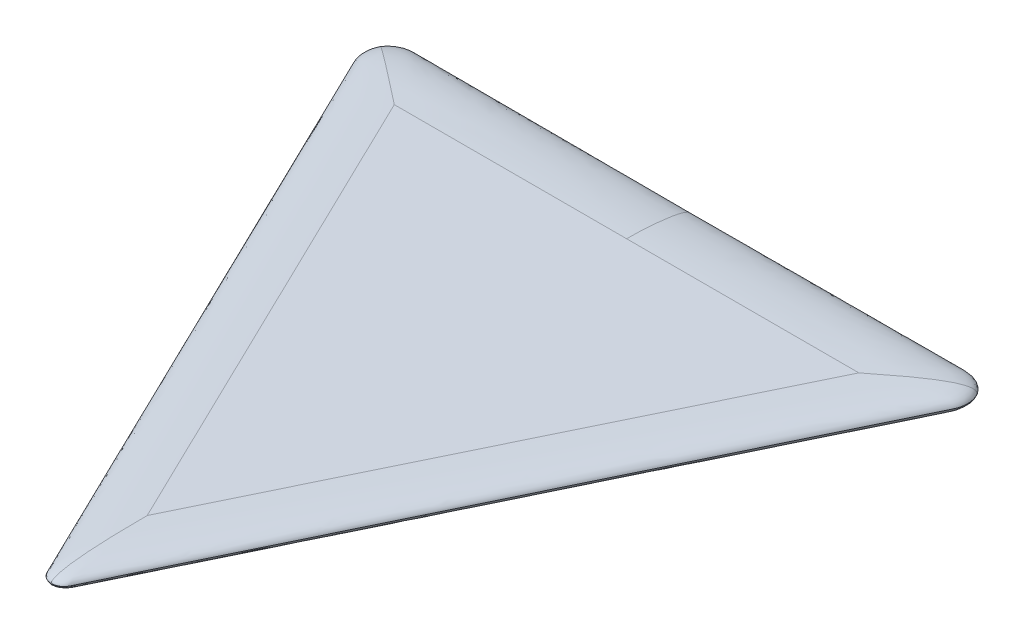
ISO-10303-21;
HEADER;
FILE_DESCRIPTION(('STEP AP214'),'2;1');
FILE_NAME('part.step','',(''),(''),'','','');
FILE_SCHEMA(('AUTOMOTIVE_DESIGN { 1 0 10303 214 1 1 1 1 }'));
ENDSEC;
DATA;
#1=APPLICATION_CONTEXT('core data for automotive mechanical design processes');
#2=APPLICATION_PROTOCOL_DEFINITION('international standard','automotive_design',2000,#1);
#3=PRODUCT_CONTEXT('',#1,'mechanical');
#4=PRODUCT('Part','Part','',(#3));
#5=PRODUCT_RELATED_PRODUCT_CATEGORY('part','',(#4));
#6=PRODUCT_DEFINITION_FORMATION('','',#4);
#7=PRODUCT_DEFINITION_CONTEXT('part definition',#1,'design');
#8=PRODUCT_DEFINITION('design','',#6,#7);
#9=PRODUCT_DEFINITION_SHAPE('','',#8);
#10=(LENGTH_UNIT() NAMED_UNIT(*) SI_UNIT(.MILLI.,.METRE.));
#11=(NAMED_UNIT(*) PLANE_ANGLE_UNIT() SI_UNIT($,.RADIAN.));
#12=(NAMED_UNIT(*) SI_UNIT($,.STERADIAN.) SOLID_ANGLE_UNIT());
#13=UNCERTAINTY_MEASURE_WITH_UNIT(LENGTH_MEASURE(1.E-05),#10,'distance_accuracy_value','');
#14=(GEOMETRIC_REPRESENTATION_CONTEXT(3) GLOBAL_UNCERTAINTY_ASSIGNED_CONTEXT((#13)) GLOBAL_UNIT_ASSIGNED_CONTEXT((#10,
#11,#12)) REPRESENTATION_CONTEXT('',''));
#15=CARTESIAN_POINT('',(0.,0.,0.));
#16=DIRECTION('',(0.,0.,1.));
#17=DIRECTION('',(1.,0.,0.));
#18=AXIS2_PLACEMENT_3D('',#15,#16,#17);
#19=CARTESIAN_POINT('',(0.,1.70008,0.));
#20=DIRECTION('',(0.,-1.,0.));
#21=DIRECTION('',(0.,0.,-1.));
#22=AXIS2_PLACEMENT_3D('',#19,#20,#21);
#23=PLANE('',#22);
#24=DIRECTION('',(1.,0.,0.));
#25=VECTOR('',#24,1.);
#26=CARTESIAN_POINT('',(18.1702141807132,1.70008,-90.));
#27=LINE('',#26,#25);
#28=CARTESIAN_POINT('',(0.,1.70008,-90.));
#29=VERTEX_POINT('',#28);
#30=CARTESIAN_POINT('',(36.3404283614264,1.70008,-90.));
#31=VERTEX_POINT('',#30);
#32=EDGE_CURVE('E117',#29,#31,#27,.T.);
#33=ORIENTED_EDGE('',*,*,#32,.F.);
#34=DIRECTION('',(-1.,0.,0.));
#35=VECTOR('',#34,1.);
#36=CARTESIAN_POINT('',(-18.1702141807132,1.70008,-90.));
#37=LINE('',#36,#35);
#38=CARTESIAN_POINT('',(-36.3404283614264,1.70008,-90.));
#39=VERTEX_POINT('',#38);
#40=EDGE_CURVE('E290',#29,#39,#37,.T.);
#41=ORIENTED_EDGE('',*,*,#40,.T.);
#42=DIRECTION('',(0.436048023411073,0.,0.899923397450748));
#43=VECTOR('',#42,1.);
#44=CARTESIAN_POINT('',(-18.1702141807132,1.70008,-52.5000000000001));
#45=LINE('',#44,#43);
#46=CARTESIAN_POINT('',(0.,1.70008,-15.));
#47=VERTEX_POINT('',#46);
#48=EDGE_CURVE('E291',#39,#47,#45,.T.);
#49=ORIENTED_EDGE('',*,*,#48,.T.);
#50=DIRECTION('',(-0.436048023411073,0.,0.899923397450748));
#51=VECTOR('',#50,1.);
#52=CARTESIAN_POINT('',(18.1702141807132,1.70008,-52.5000000000001));
#53=LINE('',#52,#51);
#54=EDGE_CURVE('E187',#31,#47,#53,.T.);
#55=ORIENTED_EDGE('',*,*,#54,.F.);
#56=EDGE_LOOP('',(#33,#41,#49,#55));
#57=FACE_BOUND('',#56,.T.);
#58=ADVANCED_FACE('F107',(#57),#23,.F.);
#59=CARTESIAN_POINT('',(0.,1.70008,-15.));
#60=CARTESIAN_POINT('',(0.253384960047637,1.70008,-15.5229402310443));
#61=CARTESIAN_POINT('',(0.506769920095274,1.70008,-16.0458804620886));
#62=CARTESIAN_POINT('',(12.1648822655975,1.70008,-40.1060928849216));
#63=CARTESIAN_POINT('',(23.5696096510522,1.70008,-63.643365076711));
#64=CARTESIAN_POINT('',(35.42970081148,1.70008,-88.1204248456664));
#65=CARTESIAN_POINT('',(35.8850645864532,1.70008,-89.0602124228332));
#66=CARTESIAN_POINT('',(36.3404283614264,1.70008,-90.));
#67=CARTESIAN_POINT('',(0.,1.70008,-14.7483994170613));
#68=CARTESIAN_POINT('',(0.262175055474778,1.70008,-15.2628231278992));
#69=CARTESIAN_POINT('',(0.523231572764904,1.70008,-15.7845503895561));
#70=CARTESIAN_POINT('',(12.2543452105578,1.70008,-39.9817941684924));
#71=CARTESIAN_POINT('',(23.7304872309625,1.70008,-63.6531193881907));
#72=CARTESIAN_POINT('',(35.6648444437097,1.70008,-88.2695846052202));
#73=CARTESIAN_POINT('',(36.1115618703193,1.70008,-89.2186910639662));
#74=CARTESIAN_POINT('',(36.5477424877341,1.70008,-90.1623624620553));
#75=CARTESIAN_POINT('',(0.,1.70008,-9.71638775828657));
#76=CARTESIAN_POINT('',(0.437976964017602,1.70007999999987,-10.0604810649973));
#77=CARTESIAN_POINT('',(0.852464626157506,1.70007999999974,-10.5579489389055));
#78=CARTESIAN_POINT('',(14.0436041097635,1.70007999999387,-37.4958198399082));
#79=CARTESIAN_POINT('',(26.9480388291692,1.70007999998813,-63.8482056177856));
#80=CARTESIAN_POINT('',(40.367717088304,1.70007999998216,-91.2527797962963));
#81=CARTESIAN_POINT('',(40.6415075476401,1.70007999998193,-92.3882638866267));
#82=CARTESIAN_POINT('',(40.6940250138874,1.7000799999817,-93.4096117031615));
#83=CARTESIAN_POINT('',(0.,1.44840525822499,0.));
#84=CARTESIAN_POINT('',(0.626841244543303,1.45005171313683,-0.216654959620347));
#85=CARTESIAN_POINT('',(1.20782242351586,1.45169816804867,-0.732755502816547));
#86=CARTESIAN_POINT('',(16.4599808033768,1.52745071599147,-32.384695120721));
#87=CARTESIAN_POINT('',(31.3806389002425,1.60155680902244,-63.3486909945762));
#88=CARTESIAN_POINT('',(46.8970435648643,1.67862178297451,-95.5490059467248));
#89=CARTESIAN_POINT('',(47.0213817375675,1.6815806638956,-96.9479499429976));
#90=CARTESIAN_POINT('',(46.7137107332878,1.68453954481669,-98.1240564523363));
#91=CARTESIAN_POINT('',(0.,0.,0.));
#92=CARTESIAN_POINT('',(0.766388457057767,0.,0.));
#93=CARTESIAN_POINT('',(1.4656646230364,0.,-0.438213049135394));
#94=CARTESIAN_POINT('',(16.8412153373915,0.,-32.1705386042371));
#95=CARTESIAN_POINT('',(31.8825838798813,0.,-63.2131732552963));
#96=CARTESIAN_POINT('',(47.5245186725572,0.,-95.4952668449226));
#97=CARTESIAN_POINT('',(47.4352189787637,0.,-96.9727134683373));
#98=CARTESIAN_POINT('',(46.7137107332878,0.,-98.1240564523363));
#99=B_SPLINE_SURFACE_WITH_KNOTS('',3,3,((#59,#60,#61,#62,#63,#64,#65,#66),(#67,#68,#69,#70,#71,
#72,#73,#74),(#75,#76,#77,#78,#79,#80,#81,#82),(#83,#84,#85,#86,#87,#88,#89,#90),(#91,#92,#93,
#94,#95,#96,#97,#98)),.UNSPECIFIED.,.F.,.F.,.F.,(4,1,4),(4,2,2,4),(0.,0.0500000000000003,1.),
(0.,0.0209176092417716,0.962408496913326,1.),.UNSPECIFIED.);
#100=CARTESIAN_POINT('',(0.,1.70008,-15.));
#101=CARTESIAN_POINT('',(0.,1.70008,-14.7483994170613));
#102=CARTESIAN_POINT('',(0.,1.70008,-9.71638775828657));
#103=CARTESIAN_POINT('',(0.,1.44840525822499,0.));
#104=CARTESIAN_POINT('',(0.,0.,0.));
#105=B_SPLINE_CURVE_WITH_KNOTS('',3,(#100,#101,#102,#103,#104),.UNSPECIFIED.,.F.,.F.,(4,1,4),
(0.,0.0500000000000003,1.),.UNSPECIFIED.);
#106=CARTESIAN_POINT('',(0.,0.,0.));
#107=VERTEX_POINT('',#106);
#108=EDGE_CURVE('E178',#47,#107,#105,.T.);
#109=CARTESIAN_POINT('',(46.7137107332878,0.,-98.1240564523363));
#110=CARTESIAN_POINT('',(47.4352189787637,0.,-96.9727134683373));
#111=CARTESIAN_POINT('',(47.5245186725572,0.,-95.4952668449226));
#112=CARTESIAN_POINT('',(31.8825838798813,0.,-63.2131732552963));
#113=CARTESIAN_POINT('',(16.8412153373915,0.,-32.1705386042371));
#114=CARTESIAN_POINT('',(1.4656646230364,0.,-0.438213049135394));
#115=CARTESIAN_POINT('',(0.766388457057767,0.,0.));
#116=CARTESIAN_POINT('',(0.,0.,0.));
#117=B_SPLINE_CURVE_WITH_KNOTS('',3,(#109,#110,#111,#112,#113,#114,#115,#116),.UNSPECIFIED.,.F.,
.F.,(4,2,2,4),(0.,0.0375915030866739,0.979082390758228,1.),.UNSPECIFIED.);
#118=CARTESIAN_POINT('',(46.7137107332888,0.,-98.1240564523345));
#119=VERTEX_POINT('',#118);
#120=EDGE_CURVE('E126',#119,#107,#117,.T.);
#121=CARTESIAN_POINT('',(36.3404283614264,1.70008,-90.));
#122=CARTESIAN_POINT('',(36.5477424877341,1.70008,-90.1623624620553));
#123=CARTESIAN_POINT('',(40.6940250138874,1.7000799999817,-93.4096117031615));
#124=CARTESIAN_POINT('',(46.7137107332878,1.68453954481669,-98.1240564523363));
#125=CARTESIAN_POINT('',(46.7137107332878,0.,-98.1240564523363));
#126=B_SPLINE_CURVE_WITH_KNOTS('',3,(#121,#122,#123,#124,#125),.UNSPECIFIED.,.F.,.F.,(4,1,4),
(0.,0.0500000000000003,1.),.UNSPECIFIED.);
#127=EDGE_CURVE('E13',#31,#119,#126,.T.);
#128=ORIENTED_EDGE('',*,*,#108,.T.);
#129=ORIENTED_EDGE('',*,*,#120,.F.);
#130=ORIENTED_EDGE('',*,*,#127,.F.);
#131=ORIENTED_EDGE('',*,*,#54,.T.);
#132=EDGE_LOOP('',(#128,#129,#130,#131));
#133=FACE_BOUND('',#132,.T.);
#134=ADVANCED_FACE('F185',(#133),#99,.T.);
#135=CARTESIAN_POINT('',(36.3404283614264,1.70008,-90.));
#136=CARTESIAN_POINT('',(35.2857398160419,1.70008,-90.));
#137=CARTESIAN_POINT('',(34.2310512706573,1.70008,-90.));
#138=CARTESIAN_POINT('',(22.1175751501819,1.70008,-90.));
#139=CARTESIAN_POINT('',(11.0587875750909,1.70008,-90.));
#140=CARTESIAN_POINT('',(0.,1.70008,-90.));
#141=CARTESIAN_POINT('',(36.5477424877341,1.70008,-90.1623624620553));
#142=CARTESIAN_POINT('',(35.4857020455283,1.70008,-90.1641963538898));
#143=CARTESIAN_POINT('',(34.423651735282,1.70008,-90.1659141197575));
#144=CARTESIAN_POINT('',(22.2276580394349,1.70008,-90.1761291989063));
#145=CARTESIAN_POINT('',(11.1055234829861,1.70008,-90.1723127937523));
#146=CARTESIAN_POINT('',(0.,1.70008,-90.1690580702388));
#147=CARTESIAN_POINT('',(40.6940250138874,1.7000799999817,-93.4096117031615));
#148=CARTESIAN_POINT('',(39.5193288204146,1.70007999998223,-93.499689218614));
#149=CARTESIAN_POINT('',(38.3159880549518,1.70007999998276,-93.5662232196789));
#150=CARTESIAN_POINT('',(24.4840947586229,1.70007999998886,-93.733507736501));
#151=CARTESIAN_POINT('',(12.0842421814155,1.70007999999443,-93.6365276301732));
#152=CARTESIAN_POINT('',(0.,1.70008,-93.5502194750155));
#153=CARTESIAN_POINT('',(46.7137107332878,1.68453954481669,-98.1240564523363));
#154=CARTESIAN_POINT('',(45.9922024878114,1.66959552312996,-99.2753994363351));
#155=CARTESIAN_POINT('',(44.7015526578853,1.65465150144322,-99.9999999999999));
#156=CARTESIAN_POINT('',(28.8828392217124,1.48301405393482,-100.000000000001));
#157=CARTESIAN_POINT('',(14.4414196108562,1.32632062811316,-100.));
#158=CARTESIAN_POINT('',(0.,1.16962720229148,-100.));
#159=CARTESIAN_POINT('',(46.7137107332878,0.,-98.1240564523363));
#160=CARTESIAN_POINT('',(45.9922024878114,0.,-99.275399436335));
#161=CARTESIAN_POINT('',(44.7015526578853,0.,-99.9999999999999));
#162=CARTESIAN_POINT('',(28.8828392217124,0.,-100.000000000001));
#163=CARTESIAN_POINT('',(14.4414196108562,0.,-100.));
#164=CARTESIAN_POINT('',(0.,0.,-100.));
#165=B_SPLINE_SURFACE_WITH_KNOTS('',3,3,((#135,#136,#137,#138,#139,#140),(#141,#142,#143,#144,
#145,#146),(#147,#148,#149,#150,#151,#152),(#153,#154,#155,#156,#157,#158),(#159,#160,#161,#162,
#163,#164)),.UNSPECIFIED.,.F.,.F.,.F.,(4,1,4),(4,2,4),(0.,0.0500000000000003,1.),(0.,
0.0870673731383997,1.),.UNSPECIFIED.);
#166=CARTESIAN_POINT('',(0.,0.,-100.));
#167=CARTESIAN_POINT('',(14.4414196108562,0.,-100.));
#168=CARTESIAN_POINT('',(28.8828392217124,0.,-100.000000000001));
#169=CARTESIAN_POINT('',(44.7015526578853,0.,-99.9999999999999));
#170=CARTESIAN_POINT('',(45.9922024878114,0.,-99.275399436335));
#171=CARTESIAN_POINT('',(46.7137107332878,0.,-98.1240564523363));
#172=B_SPLINE_CURVE_WITH_KNOTS('',3,(#166,#167,#168,#169,#170,#171),.UNSPECIFIED.,.F.,.F.,(4,2,
4),(0.,0.9129326268616,1.),.UNSPECIFIED.);
#173=CARTESIAN_POINT('',(0.,0.,-100.));
#174=VERTEX_POINT('',#173);
#175=EDGE_CURVE('E197',#174,#119,#172,.T.);
#176=CARTESIAN_POINT('',(0.,0.,-100.));
#177=CARTESIAN_POINT('',(0.,1.16962720229148,-100.));
#178=CARTESIAN_POINT('',(0.,1.70008,-93.5502194750155));
#179=CARTESIAN_POINT('',(0.,1.70008,-90.1690580702388));
#180=CARTESIAN_POINT('',(0.,1.70008,-90.));
#181=B_SPLINE_CURVE_WITH_KNOTS('',3,(#176,#177,#178,#179,#180),.UNSPECIFIED.,.F.,.F.,(4,1,4),
(0.,0.95,1.),.UNSPECIFIED.);
#182=EDGE_CURVE('E190',#174,#29,#181,.T.);
#183=ORIENTED_EDGE('',*,*,#127,.T.);
#184=ORIENTED_EDGE('',*,*,#175,.F.);
#185=ORIENTED_EDGE('',*,*,#182,.T.);
#186=ORIENTED_EDGE('',*,*,#32,.T.);
#187=EDGE_LOOP('',(#183,#184,#185,#186));
#188=FACE_BOUND('',#187,.T.);
#189=ADVANCED_FACE('F233',(#188),#165,.T.);
#190=CARTESIAN_POINT('',(0.,-1.70008,0.));
#191=DIRECTION('',(0.,1.,0.));
#192=DIRECTION('',(0.,0.,-1.));
#193=AXIS2_PLACEMENT_3D('',#190,#191,#192);
#194=PLANE('',#193);
#195=DIRECTION('',(-0.436048023411073,0.,0.899923397450748));
#196=VECTOR('',#195,1.);
#197=CARTESIAN_POINT('',(18.1702141807132,-1.70008,-52.5000000000001));
#198=LINE('',#197,#196);
#199=CARTESIAN_POINT('',(36.3404283614264,-1.70008,-90.));
#200=VERTEX_POINT('',#199);
#201=CARTESIAN_POINT('',(0.,-1.70008,-15.));
#202=VERTEX_POINT('',#201);
#203=EDGE_CURVE('E189',#200,#202,#198,.T.);
#204=ORIENTED_EDGE('',*,*,#203,.T.);
#205=DIRECTION('',(0.436048023411073,0.,0.899923397450748));
#206=VECTOR('',#205,1.);
#207=CARTESIAN_POINT('',(-18.1702141807132,-1.70008,-52.5000000000001));
#208=LINE('',#207,#206);
#209=CARTESIAN_POINT('',(-36.3404283614264,-1.70008,-90.));
#210=VERTEX_POINT('',#209);
#211=EDGE_CURVE('E166',#210,#202,#208,.T.);
#212=ORIENTED_EDGE('',*,*,#211,.F.);
#213=DIRECTION('',(-1.,0.,0.));
#214=VECTOR('',#213,1.);
#215=CARTESIAN_POINT('',(-18.1702141807132,-1.70008,-90.));
#216=LINE('',#215,#214);
#217=CARTESIAN_POINT('',(0.,-1.70008,-90.));
#218=VERTEX_POINT('',#217);
#219=EDGE_CURVE('E339',#218,#210,#216,.T.);
#220=ORIENTED_EDGE('',*,*,#219,.F.);
#221=DIRECTION('',(1.,0.,0.));
#222=VECTOR('',#221,1.);
#223=CARTESIAN_POINT('',(18.1702141807132,-1.70008,-90.));
#224=LINE('',#223,#222);
#225=EDGE_CURVE('E320',#218,#200,#224,.T.);
#226=ORIENTED_EDGE('',*,*,#225,.T.);
#227=EDGE_LOOP('',(#204,#212,#220,#226));
#228=FACE_BOUND('',#227,.T.);
#229=ADVANCED_FACE('F221',(#228),#194,.F.);
#230=CARTESIAN_POINT('',(0.,-1.70008,-15.));
#231=CARTESIAN_POINT('',(0.253384960047637,-1.70008,-15.5229402310443));
#232=CARTESIAN_POINT('',(0.506769920095274,-1.70008,-16.0458804620886));
#233=CARTESIAN_POINT('',(12.1648822655975,-1.70008,-40.1060928849216));
#234=CARTESIAN_POINT('',(23.5696096510522,-1.70008,-63.643365076711));
#235=CARTESIAN_POINT('',(35.42970081148,-1.70008,-88.1204248456664));
#236=CARTESIAN_POINT('',(35.8850645864532,-1.70008,-89.0602124228332));
#237=CARTESIAN_POINT('',(36.3404283614264,-1.70008,-90.));
#238=CARTESIAN_POINT('',(0.,-1.70008,-14.7483994170613));
#239=CARTESIAN_POINT('',(0.262175055474778,-1.70008,-15.2628231278992));
#240=CARTESIAN_POINT('',(0.523231572764904,-1.70008,-15.7845503895561));
#241=CARTESIAN_POINT('',(12.2543452105578,-1.70008,-39.9817941684924));
#242=CARTESIAN_POINT('',(23.7304872309625,-1.70008,-63.6531193881907));
#243=CARTESIAN_POINT('',(35.6648444437097,-1.70008,-88.2695846052202));
#244=CARTESIAN_POINT('',(36.1115618703193,-1.70008,-89.2186910639662));
#245=CARTESIAN_POINT('',(36.5477424877341,-1.70008,-90.1623624620553));
#246=CARTESIAN_POINT('',(0.,-1.70008,-9.71638775828657));
#247=CARTESIAN_POINT('',(0.437976964017602,-1.70007999999987,-10.0604810649973));
#248=CARTESIAN_POINT('',(0.852464626157506,-1.70007999999974,-10.5579489389055));
#249=CARTESIAN_POINT('',(14.0436041097635,-1.70007999999387,-37.4958198399082));
#250=CARTESIAN_POINT('',(26.9480388291692,-1.70007999998813,-63.8482056177856));
#251=CARTESIAN_POINT('',(40.367717088304,-1.70007999998216,-91.2527797962963));
#252=CARTESIAN_POINT('',(40.6415075476401,-1.70007999998193,-92.3882638866267));
#253=CARTESIAN_POINT('',(40.6940250138874,-1.7000799999817,-93.4096117031615));
#254=CARTESIAN_POINT('',(0.,-1.44840525822499,0.));
#255=CARTESIAN_POINT('',(0.626841244543303,-1.45005171313683,-0.216654959620347));
#256=CARTESIAN_POINT('',(1.20782242351586,-1.45169816804867,-0.732755502816547));
#257=CARTESIAN_POINT('',(16.4599808033768,-1.52745071599147,-32.384695120721));
#258=CARTESIAN_POINT('',(31.3806389002425,-1.60155680902244,-63.3486909945762));
#259=CARTESIAN_POINT('',(46.8970435648643,-1.67862178297451,-95.5490059467248));
#260=CARTESIAN_POINT('',(47.0213817375675,-1.6815806638956,-96.9479499429976));
#261=CARTESIAN_POINT('',(46.7137107332878,-1.68453954481669,-98.1240564523363));
#262=CARTESIAN_POINT('',(0.,0.,0.));
#263=CARTESIAN_POINT('',(0.766388457057767,0.,0.));
#264=CARTESIAN_POINT('',(1.4656646230364,0.,-0.438213049135394));
#265=CARTESIAN_POINT('',(16.8412153373915,0.,-32.1705386042371));
#266=CARTESIAN_POINT('',(31.8825838798813,0.,-63.2131732552963));
#267=CARTESIAN_POINT('',(47.5245186725572,0.,-95.4952668449226));
#268=CARTESIAN_POINT('',(47.4352189787637,0.,-96.9727134683373));
#269=CARTESIAN_POINT('',(46.7137107332878,0.,-98.1240564523363));
#270=B_SPLINE_SURFACE_WITH_KNOTS('',3,3,((#230,#231,#232,#233,#234,#235,#236,#237),(#238,#239,
#240,#241,#242,#243,#244,#245),(#246,#247,#248,#249,#250,#251,#252,#253),(#254,#255,#256,#257,
#258,#259,#260,#261),(#262,#263,#264,#265,#266,#267,#268,#269)),.UNSPECIFIED.,.F.,.F.,.F.,(4,1,
4),(4,2,2,4),(0.,0.0500000000000003,1.),(0.,0.0209176092417716,0.962408496913326,1.),.UNSPECIFIED.);
#271=CARTESIAN_POINT('',(0.,-1.70008,-15.));
#272=CARTESIAN_POINT('',(0.,-1.70008,-14.7483994170613));
#273=CARTESIAN_POINT('',(0.,-1.70008,-9.71638775828657));
#274=CARTESIAN_POINT('',(0.,-1.44840525822499,0.));
#275=CARTESIAN_POINT('',(0.,0.,0.));
#276=B_SPLINE_CURVE_WITH_KNOTS('',3,(#271,#272,#273,#274,#275),.UNSPECIFIED.,.F.,.F.,(4,1,4),
(0.,0.0500000000000003,1.),.UNSPECIFIED.);
#277=EDGE_CURVE('E159',#202,#107,#276,.T.);
#278=CARTESIAN_POINT('',(36.3404283614264,-1.70008,-90.));
#279=CARTESIAN_POINT('',(36.5477424877341,-1.70008,-90.1623624620553));
#280=CARTESIAN_POINT('',(40.6940250138874,-1.7000799999817,-93.4096117031615));
#281=CARTESIAN_POINT('',(46.7137107332878,-1.68453954481669,-98.1240564523363));
#282=CARTESIAN_POINT('',(46.7137107332878,0.,-98.1240564523363));
#283=B_SPLINE_CURVE_WITH_KNOTS('',3,(#278,#279,#280,#281,#282),.UNSPECIFIED.,.F.,.F.,(4,1,4),
(0.,0.0500000000000003,1.),.UNSPECIFIED.);
#284=EDGE_CURVE('E195',#200,#119,#283,.T.);
#285=ORIENTED_EDGE('',*,*,#277,.F.);
#286=ORIENTED_EDGE('',*,*,#203,.F.);
#287=ORIENTED_EDGE('',*,*,#284,.T.);
#288=ORIENTED_EDGE('',*,*,#120,.T.);
#289=EDGE_LOOP('',(#285,#286,#287,#288));
#290=FACE_BOUND('',#289,.T.);
#291=ADVANCED_FACE('F194',(#290),#270,.F.);
#292=CARTESIAN_POINT('',(36.3404283614264,-1.70008,-90.));
#293=CARTESIAN_POINT('',(35.2857398160419,-1.70008,-90.));
#294=CARTESIAN_POINT('',(34.2310512706573,-1.70008,-90.));
#295=CARTESIAN_POINT('',(22.1175751501819,-1.70008,-90.));
#296=CARTESIAN_POINT('',(11.0587875750909,-1.70008,-90.));
#297=CARTESIAN_POINT('',(0.,-1.70008,-90.));
#298=CARTESIAN_POINT('',(36.5477424877341,-1.70008,-90.1623624620553));
#299=CARTESIAN_POINT('',(35.4857020455283,-1.70008,-90.1641963538898));
#300=CARTESIAN_POINT('',(34.423651735282,-1.70008,-90.1659141197575));
#301=CARTESIAN_POINT('',(22.2276580394349,-1.70008,-90.1761291989063));
#302=CARTESIAN_POINT('',(11.1055234829861,-1.70008,-90.1723127937523));
#303=CARTESIAN_POINT('',(0.,-1.70008,-90.1690580702388));
#304=CARTESIAN_POINT('',(40.6940250138874,-1.7000799999817,-93.4096117031615));
#305=CARTESIAN_POINT('',(39.5193288204146,-1.70007999998223,-93.499689218614));
#306=CARTESIAN_POINT('',(38.3159880549518,-1.70007999998276,-93.5662232196789));
#307=CARTESIAN_POINT('',(24.4840947586229,-1.70007999998886,-93.733507736501));
#308=CARTESIAN_POINT('',(12.0842421814155,-1.70007999999443,-93.6365276301732));
#309=CARTESIAN_POINT('',(0.,-1.70008,-93.5502194750155));
#310=CARTESIAN_POINT('',(46.7137107332878,-1.68453954481669,-98.1240564523363));
#311=CARTESIAN_POINT('',(45.9922024878114,-1.66959552312996,-99.2753994363351));
#312=CARTESIAN_POINT('',(44.7015526578853,-1.65465150144322,-99.9999999999999));
#313=CARTESIAN_POINT('',(28.8828392217124,-1.48301405393482,-100.000000000001));
#314=CARTESIAN_POINT('',(14.4414196108562,-1.32632062811316,-100.));
#315=CARTESIAN_POINT('',(0.,-1.16962720229148,-100.));
#316=CARTESIAN_POINT('',(46.7137107332878,0.,-98.1240564523363));
#317=CARTESIAN_POINT('',(45.9922024878114,0.,-99.275399436335));
#318=CARTESIAN_POINT('',(44.7015526578853,0.,-99.9999999999999));
#319=CARTESIAN_POINT('',(28.8828392217124,0.,-100.000000000001));
#320=CARTESIAN_POINT('',(14.4414196108562,0.,-100.));
#321=CARTESIAN_POINT('',(0.,0.,-100.));
#322=B_SPLINE_SURFACE_WITH_KNOTS('',3,3,((#292,#293,#294,#295,#296,#297),(#298,#299,#300,#301,
#302,#303),(#304,#305,#306,#307,#308,#309),(#310,#311,#312,#313,#314,#315),(#316,#317,#318,#319,
#320,#321)),.UNSPECIFIED.,.F.,.F.,.F.,(4,1,4),(4,2,4),(0.,0.0500000000000003,1.),(0.,
0.0870673731383997,1.),.UNSPECIFIED.);
#323=CARTESIAN_POINT('',(0.,0.,-100.));
#324=CARTESIAN_POINT('',(0.,-1.16962720229148,-100.));
#325=CARTESIAN_POINT('',(0.,-1.70008,-93.5502194750155));
#326=CARTESIAN_POINT('',(0.,-1.70008,-90.1690580702388));
#327=CARTESIAN_POINT('',(0.,-1.70008,-90.));
#328=B_SPLINE_CURVE_WITH_KNOTS('',3,(#323,#324,#325,#326,#327),.UNSPECIFIED.,.F.,.F.,(4,1,4),
(0.,0.95,1.),.UNSPECIFIED.);
#329=EDGE_CURVE('E171',#174,#218,#328,.T.);
#330=ORIENTED_EDGE('',*,*,#284,.F.);
#331=ORIENTED_EDGE('',*,*,#225,.F.);
#332=ORIENTED_EDGE('',*,*,#329,.F.);
#333=ORIENTED_EDGE('',*,*,#175,.T.);
#334=EDGE_LOOP('',(#330,#331,#332,#333));
#335=FACE_BOUND('',#334,.T.);
#336=ADVANCED_FACE('F220',(#335),#322,.F.);
#337=CARTESIAN_POINT('',(0.,1.70008,-15.));
#338=CARTESIAN_POINT('',(-0.253384960047637,1.70008,-15.5229402310443));
#339=CARTESIAN_POINT('',(-0.506769920095274,1.70008,-16.0458804620886));
#340=CARTESIAN_POINT('',(-12.1648822655975,1.70008,-40.1060928849216));
#341=CARTESIAN_POINT('',(-23.5696096510522,1.70008,-63.643365076711));
#342=CARTESIAN_POINT('',(-35.42970081148,1.70008,-88.1204248456664));
#343=CARTESIAN_POINT('',(-35.8850645864532,1.70008,-89.0602124228332));
#344=CARTESIAN_POINT('',(-36.3404283614264,1.70008,-90.));
#345=CARTESIAN_POINT('',(0.,1.70008,-14.7483994170613));
#346=CARTESIAN_POINT('',(-0.262175055474778,1.70008,-15.2628231278992));
#347=CARTESIAN_POINT('',(-0.523231572764904,1.70008,-15.7845503895561));
#348=CARTESIAN_POINT('',(-12.2543452105578,1.70008,-39.9817941684924));
#349=CARTESIAN_POINT('',(-23.7304872309625,1.70008,-63.6531193881907));
#350=CARTESIAN_POINT('',(-35.6648444437097,1.70008,-88.2695846052202));
#351=CARTESIAN_POINT('',(-36.1115618703193,1.70008,-89.2186910639662));
#352=CARTESIAN_POINT('',(-36.5477424877341,1.70008,-90.1623624620553));
#353=CARTESIAN_POINT('',(0.,1.70008,-9.71638775828657));
#354=CARTESIAN_POINT('',(-0.437976964017602,1.70007999999987,-10.0604810649973));
#355=CARTESIAN_POINT('',(-0.852464626157506,1.70007999999974,-10.5579489389055));
#356=CARTESIAN_POINT('',(-14.0436041097635,1.70007999999387,-37.4958198399082));
#357=CARTESIAN_POINT('',(-26.9480388291692,1.70007999998813,-63.8482056177856));
#358=CARTESIAN_POINT('',(-40.367717088304,1.70007999998216,-91.2527797962963));
#359=CARTESIAN_POINT('',(-40.6415075476401,1.70007999998193,-92.3882638866267));
#360=CARTESIAN_POINT('',(-40.6940250138874,1.7000799999817,-93.4096117031615));
#361=CARTESIAN_POINT('',(0.,1.44840525822499,0.));
#362=CARTESIAN_POINT('',(-0.626841244543303,1.45005171313683,-0.216654959620347));
#363=CARTESIAN_POINT('',(-1.20782242351586,1.45169816804867,-0.732755502816547));
#364=CARTESIAN_POINT('',(-16.4599808033768,1.52745071599147,-32.384695120721));
#365=CARTESIAN_POINT('',(-31.3806389002425,1.60155680902244,-63.3486909945762));
#366=CARTESIAN_POINT('',(-46.8970435648643,1.67862178297451,-95.5490059467248));
#367=CARTESIAN_POINT('',(-47.0213817375675,1.6815806638956,-96.9479499429976));
#368=CARTESIAN_POINT('',(-46.7137107332878,1.68453954481669,-98.1240564523363));
#369=CARTESIAN_POINT('',(0.,0.,0.));
#370=CARTESIAN_POINT('',(-0.766388457057767,0.,0.));
#371=CARTESIAN_POINT('',(-1.4656646230364,0.,-0.438213049135394));
#372=CARTESIAN_POINT('',(-16.8412153373915,0.,-32.1705386042371));
#373=CARTESIAN_POINT('',(-31.8825838798813,0.,-63.2131732552963));
#374=CARTESIAN_POINT('',(-47.5245186725572,0.,-95.4952668449226));
#375=CARTESIAN_POINT('',(-47.4352189787637,0.,-96.9727134683373));
#376=CARTESIAN_POINT('',(-46.7137107332878,0.,-98.1240564523363));
#377=B_SPLINE_SURFACE_WITH_KNOTS('',3,3,((#337,#338,#339,#340,#341,#342,#343,#344),(#345,#346,
#347,#348,#349,#350,#351,#352),(#353,#354,#355,#356,#357,#358,#359,#360),(#361,#362,#363,#364,
#365,#366,#367,#368),(#369,#370,#371,#372,#373,#374,#375,#376)),.UNSPECIFIED.,.F.,.F.,.F.,(4,1,
4),(4,2,2,4),(0.,0.0500000000000003,1.),(0.,0.0209176092417716,0.962408496913326,1.),.UNSPECIFIED.);
#378=CARTESIAN_POINT('',(-36.3404283614264,1.70008,-90.));
#379=CARTESIAN_POINT('',(-36.5477424877341,1.70008,-90.1623624620553));
#380=CARTESIAN_POINT('',(-40.6940250138874,1.7000799999817,-93.4096117031615));
#381=CARTESIAN_POINT('',(-46.7137107332878,1.68453954481669,-98.1240564523363));
#382=CARTESIAN_POINT('',(-46.7137107332878,0.,-98.1240564523363));
#383=B_SPLINE_CURVE_WITH_KNOTS('',3,(#378,#379,#380,#381,#382),.UNSPECIFIED.,.F.,.F.,(4,1,4),
(0.,0.0500000000000003,1.),.UNSPECIFIED.);
#384=CARTESIAN_POINT('',(-46.7137107332888,0.,-98.1240564523345));
#385=VERTEX_POINT('',#384);
#386=EDGE_CURVE('E180',#39,#385,#383,.T.);
#387=CARTESIAN_POINT('',(-46.7137107332878,0.,-98.1240564523363));
#388=CARTESIAN_POINT('',(-47.4352189787637,0.,-96.9727134683373));
#389=CARTESIAN_POINT('',(-47.5245186725572,0.,-95.4952668449226));
#390=CARTESIAN_POINT('',(-31.8825838798813,0.,-63.2131732552963));
#391=CARTESIAN_POINT('',(-16.8412153373915,0.,-32.1705386042371));
#392=CARTESIAN_POINT('',(-1.4656646230364,0.,-0.438213049135394));
#393=CARTESIAN_POINT('',(-0.766388457057767,0.,0.));
#394=CARTESIAN_POINT('',(0.,0.,0.));
#395=B_SPLINE_CURVE_WITH_KNOTS('',3,(#387,#388,#389,#390,#391,#392,#393,#394),.UNSPECIFIED.,.F.,
.F.,(4,2,2,4),(0.,0.0375915030866739,0.979082390758228,1.),.UNSPECIFIED.);
#396=EDGE_CURVE('E162',#385,#107,#395,.T.);
#397=ORIENTED_EDGE('',*,*,#108,.F.);
#398=ORIENTED_EDGE('',*,*,#48,.F.);
#399=ORIENTED_EDGE('',*,*,#386,.T.);
#400=ORIENTED_EDGE('',*,*,#396,.T.);
#401=EDGE_LOOP('',(#397,#398,#399,#400));
#402=FACE_BOUND('',#401,.T.);
#403=ADVANCED_FACE('F176',(#402),#377,.F.);
#404=CARTESIAN_POINT('',(-36.3404283614264,1.70008,-90.));
#405=CARTESIAN_POINT('',(-35.2857398160419,1.70008,-90.));
#406=CARTESIAN_POINT('',(-34.2310512706573,1.70008,-90.));
#407=CARTESIAN_POINT('',(-22.1175751501819,1.70008,-90.));
#408=CARTESIAN_POINT('',(-11.0587875750909,1.70008,-90.));
#409=CARTESIAN_POINT('',(0.,1.70008,-90.));
#410=CARTESIAN_POINT('',(-36.5477424877341,1.70008,-90.1623624620553));
#411=CARTESIAN_POINT('',(-35.4857020455283,1.70008,-90.1641963538898));
#412=CARTESIAN_POINT('',(-34.423651735282,1.70008,-90.1659141197575));
#413=CARTESIAN_POINT('',(-22.2276580394349,1.70008,-90.1761291989063));
#414=CARTESIAN_POINT('',(-11.1055234829861,1.70008,-90.1723127937523));
#415=CARTESIAN_POINT('',(0.,1.70008,-90.1690580702388));
#416=CARTESIAN_POINT('',(-40.6940250138874,1.7000799999817,-93.4096117031615));
#417=CARTESIAN_POINT('',(-39.5193288204146,1.70007999998223,-93.499689218614));
#418=CARTESIAN_POINT('',(-38.3159880549518,1.70007999998276,-93.5662232196789));
#419=CARTESIAN_POINT('',(-24.4840947586229,1.70007999998886,-93.733507736501));
#420=CARTESIAN_POINT('',(-12.0842421814155,1.70007999999443,-93.6365276301732));
#421=CARTESIAN_POINT('',(0.,1.70008,-93.5502194750155));
#422=CARTESIAN_POINT('',(-46.7137107332878,1.68453954481669,-98.1240564523363));
#423=CARTESIAN_POINT('',(-45.9922024878114,1.66959552312996,-99.2753994363351));
#424=CARTESIAN_POINT('',(-44.7015526578853,1.65465150144322,-99.9999999999999));
#425=CARTESIAN_POINT('',(-28.8828392217124,1.48301405393482,-100.000000000001));
#426=CARTESIAN_POINT('',(-14.4414196108562,1.32632062811316,-100.));
#427=CARTESIAN_POINT('',(0.,1.16962720229148,-100.));
#428=CARTESIAN_POINT('',(-46.7137107332878,0.,-98.1240564523363));
#429=CARTESIAN_POINT('',(-45.9922024878114,0.,-99.275399436335));
#430=CARTESIAN_POINT('',(-44.7015526578853,0.,-99.9999999999999));
#431=CARTESIAN_POINT('',(-28.8828392217124,0.,-100.000000000001));
#432=CARTESIAN_POINT('',(-14.4414196108562,0.,-100.));
#433=CARTESIAN_POINT('',(0.,0.,-100.));
#434=B_SPLINE_SURFACE_WITH_KNOTS('',3,3,((#404,#405,#406,#407,#408,#409),(#410,#411,#412,#413,
#414,#415),(#416,#417,#418,#419,#420,#421),(#422,#423,#424,#425,#426,#427),(#428,#429,#430,#431,
#432,#433)),.UNSPECIFIED.,.F.,.F.,.F.,(4,1,4),(4,2,4),(0.,0.0500000000000003,1.),(0.,
0.0870673731383997,1.),.UNSPECIFIED.);
#435=CARTESIAN_POINT('',(0.,0.,-100.));
#436=CARTESIAN_POINT('',(-14.4414196108562,0.,-100.));
#437=CARTESIAN_POINT('',(-28.8828392217124,0.,-100.000000000001));
#438=CARTESIAN_POINT('',(-44.7015526578853,0.,-99.9999999999999));
#439=CARTESIAN_POINT('',(-45.9922024878114,0.,-99.275399436335));
#440=CARTESIAN_POINT('',(-46.7137107332878,0.,-98.1240564523363));
#441=B_SPLINE_CURVE_WITH_KNOTS('',3,(#435,#436,#437,#438,#439,#440),.UNSPECIFIED.,.F.,.F.,(4,2,
4),(0.,0.9129326268616,1.),.UNSPECIFIED.);
#442=EDGE_CURVE('E182',#174,#385,#441,.T.);
#443=ORIENTED_EDGE('',*,*,#386,.F.);
#444=ORIENTED_EDGE('',*,*,#40,.F.);
#445=ORIENTED_EDGE('',*,*,#182,.F.);
#446=ORIENTED_EDGE('',*,*,#442,.T.);
#447=EDGE_LOOP('',(#443,#444,#445,#446));
#448=FACE_BOUND('',#447,.T.);
#449=ADVANCED_FACE('F381',(#448),#434,.F.);
#450=CARTESIAN_POINT('',(0.,-1.70008,-15.));
#451=CARTESIAN_POINT('',(-0.253384960047637,-1.70008,-15.5229402310443));
#452=CARTESIAN_POINT('',(-0.506769920095274,-1.70008,-16.0458804620886));
#453=CARTESIAN_POINT('',(-12.1648822655975,-1.70008,-40.1060928849216));
#454=CARTESIAN_POINT('',(-23.5696096510522,-1.70008,-63.643365076711));
#455=CARTESIAN_POINT('',(-35.42970081148,-1.70008,-88.1204248456664));
#456=CARTESIAN_POINT('',(-35.8850645864532,-1.70008,-89.0602124228332));
#457=CARTESIAN_POINT('',(-36.3404283614264,-1.70008,-90.));
#458=CARTESIAN_POINT('',(0.,-1.70008,-14.7483994170613));
#459=CARTESIAN_POINT('',(-0.262175055474778,-1.70008,-15.2628231278992));
#460=CARTESIAN_POINT('',(-0.523231572764904,-1.70008,-15.7845503895561));
#461=CARTESIAN_POINT('',(-12.2543452105578,-1.70008,-39.9817941684924));
#462=CARTESIAN_POINT('',(-23.7304872309625,-1.70008,-63.6531193881907));
#463=CARTESIAN_POINT('',(-35.6648444437097,-1.70008,-88.2695846052202));
#464=CARTESIAN_POINT('',(-36.1115618703193,-1.70008,-89.2186910639662));
#465=CARTESIAN_POINT('',(-36.5477424877341,-1.70008,-90.1623624620553));
#466=CARTESIAN_POINT('',(0.,-1.70008,-9.71638775828657));
#467=CARTESIAN_POINT('',(-0.437976964017602,-1.70007999999987,-10.0604810649973));
#468=CARTESIAN_POINT('',(-0.852464626157506,-1.70007999999974,-10.5579489389055));
#469=CARTESIAN_POINT('',(-14.0436041097635,-1.70007999999387,-37.4958198399082));
#470=CARTESIAN_POINT('',(-26.9480388291692,-1.70007999998813,-63.8482056177856));
#471=CARTESIAN_POINT('',(-40.367717088304,-1.70007999998216,-91.2527797962963));
#472=CARTESIAN_POINT('',(-40.6415075476401,-1.70007999998193,-92.3882638866267));
#473=CARTESIAN_POINT('',(-40.6940250138874,-1.7000799999817,-93.4096117031615));
#474=CARTESIAN_POINT('',(0.,-1.44840525822499,0.));
#475=CARTESIAN_POINT('',(-0.626841244543303,-1.45005171313683,-0.216654959620347));
#476=CARTESIAN_POINT('',(-1.20782242351586,-1.45169816804867,-0.732755502816547));
#477=CARTESIAN_POINT('',(-16.4599808033768,-1.52745071599147,-32.384695120721));
#478=CARTESIAN_POINT('',(-31.3806389002425,-1.60155680902244,-63.3486909945762));
#479=CARTESIAN_POINT('',(-46.8970435648643,-1.67862178297451,-95.5490059467248));
#480=CARTESIAN_POINT('',(-47.0213817375675,-1.6815806638956,-96.9479499429976));
#481=CARTESIAN_POINT('',(-46.7137107332878,-1.68453954481669,-98.1240564523363));
#482=CARTESIAN_POINT('',(0.,0.,0.));
#483=CARTESIAN_POINT('',(-0.766388457057767,0.,0.));
#484=CARTESIAN_POINT('',(-1.4656646230364,0.,-0.438213049135394));
#485=CARTESIAN_POINT('',(-16.8412153373915,0.,-32.1705386042371));
#486=CARTESIAN_POINT('',(-31.8825838798813,0.,-63.2131732552963));
#487=CARTESIAN_POINT('',(-47.5245186725572,0.,-95.4952668449226));
#488=CARTESIAN_POINT('',(-47.4352189787637,0.,-96.9727134683373));
#489=CARTESIAN_POINT('',(-46.7137107332878,0.,-98.1240564523363));
#490=B_SPLINE_SURFACE_WITH_KNOTS('',3,3,((#450,#451,#452,#453,#454,#455,#456,#457),(#458,#459,
#460,#461,#462,#463,#464,#465),(#466,#467,#468,#469,#470,#471,#472,#473),(#474,#475,#476,#477,
#478,#479,#480,#481),(#482,#483,#484,#485,#486,#487,#488,#489)),.UNSPECIFIED.,.F.,.F.,.F.,(4,1,
4),(4,2,2,4),(0.,0.0500000000000003,1.),(0.,0.0209176092417716,0.962408496913326,1.),.UNSPECIFIED.);
#491=CARTESIAN_POINT('',(-36.3404283614264,-1.70008,-90.));
#492=CARTESIAN_POINT('',(-36.5477424877341,-1.70008,-90.1623624620553));
#493=CARTESIAN_POINT('',(-40.6940250138874,-1.7000799999817,-93.4096117031615));
#494=CARTESIAN_POINT('',(-46.7137107332878,-1.68453954481669,-98.1240564523363));
#495=CARTESIAN_POINT('',(-46.7137107332878,0.,-98.1240564523363));
#496=B_SPLINE_CURVE_WITH_KNOTS('',3,(#491,#492,#493,#494,#495),.UNSPECIFIED.,.F.,.F.,(4,1,4),
(0.,0.0500000000000003,1.),.UNSPECIFIED.);
#497=EDGE_CURVE('E348',#210,#385,#496,.T.);
#498=ORIENTED_EDGE('',*,*,#277,.T.);
#499=ORIENTED_EDGE('',*,*,#396,.F.);
#500=ORIENTED_EDGE('',*,*,#497,.F.);
#501=ORIENTED_EDGE('',*,*,#211,.T.);
#502=EDGE_LOOP('',(#498,#499,#500,#501));
#503=FACE_BOUND('',#502,.T.);
#504=ADVANCED_FACE('F161',(#503),#490,.T.);
#505=CARTESIAN_POINT('',(-36.3404283614264,-1.70008,-90.));
#506=CARTESIAN_POINT('',(-35.2857398160419,-1.70008,-90.));
#507=CARTESIAN_POINT('',(-34.2310512706573,-1.70008,-90.));
#508=CARTESIAN_POINT('',(-22.1175751501819,-1.70008,-90.));
#509=CARTESIAN_POINT('',(-11.0587875750909,-1.70008,-90.));
#510=CARTESIAN_POINT('',(0.,-1.70008,-90.));
#511=CARTESIAN_POINT('',(-36.5477424877341,-1.70008,-90.1623624620553));
#512=CARTESIAN_POINT('',(-35.4857020455283,-1.70008,-90.1641963538898));
#513=CARTESIAN_POINT('',(-34.423651735282,-1.70008,-90.1659141197575));
#514=CARTESIAN_POINT('',(-22.2276580394349,-1.70008,-90.1761291989063));
#515=CARTESIAN_POINT('',(-11.1055234829861,-1.70008,-90.1723127937523));
#516=CARTESIAN_POINT('',(0.,-1.70008,-90.1690580702388));
#517=CARTESIAN_POINT('',(-40.6940250138874,-1.7000799999817,-93.4096117031615));
#518=CARTESIAN_POINT('',(-39.5193288204146,-1.70007999998223,-93.499689218614));
#519=CARTESIAN_POINT('',(-38.3159880549518,-1.70007999998276,-93.5662232196789));
#520=CARTESIAN_POINT('',(-24.4840947586229,-1.70007999998886,-93.733507736501));
#521=CARTESIAN_POINT('',(-12.0842421814155,-1.70007999999443,-93.6365276301732));
#522=CARTESIAN_POINT('',(0.,-1.70008,-93.5502194750155));
#523=CARTESIAN_POINT('',(-46.7137107332878,-1.68453954481669,-98.1240564523363));
#524=CARTESIAN_POINT('',(-45.9922024878114,-1.66959552312996,-99.2753994363351));
#525=CARTESIAN_POINT('',(-44.7015526578853,-1.65465150144322,-99.9999999999999));
#526=CARTESIAN_POINT('',(-28.8828392217124,-1.48301405393482,-100.000000000001));
#527=CARTESIAN_POINT('',(-14.4414196108562,-1.32632062811316,-100.));
#528=CARTESIAN_POINT('',(0.,-1.16962720229148,-100.));
#529=CARTESIAN_POINT('',(-46.7137107332878,0.,-98.1240564523363));
#530=CARTESIAN_POINT('',(-45.9922024878114,0.,-99.275399436335));
#531=CARTESIAN_POINT('',(-44.7015526578853,0.,-99.9999999999999));
#532=CARTESIAN_POINT('',(-28.8828392217124,0.,-100.000000000001));
#533=CARTESIAN_POINT('',(-14.4414196108562,0.,-100.));
#534=CARTESIAN_POINT('',(0.,0.,-100.));
#535=B_SPLINE_SURFACE_WITH_KNOTS('',3,3,((#505,#506,#507,#508,#509,#510),(#511,#512,#513,#514,
#515,#516),(#517,#518,#519,#520,#521,#522),(#523,#524,#525,#526,#527,#528),(#529,#530,#531,#532,
#533,#534)),.UNSPECIFIED.,.F.,.F.,.F.,(4,1,4),(4,2,4),(0.,0.0500000000000003,1.),(0.,
0.0870673731383997,1.),.UNSPECIFIED.);
#536=ORIENTED_EDGE('',*,*,#497,.T.);
#537=ORIENTED_EDGE('',*,*,#442,.F.);
#538=ORIENTED_EDGE('',*,*,#329,.T.);
#539=ORIENTED_EDGE('',*,*,#219,.T.);
#540=EDGE_LOOP('',(#536,#537,#538,#539));
#541=FACE_BOUND('',#540,.T.);
#542=ADVANCED_FACE('F442',(#541),#535,.T.);
#543=CLOSED_SHELL('',(#58,#134,#189,#229,#291,#336,#403,#449,#504,#542));
#544=MANIFOLD_SOLID_BREP('B2',#543);
#545=ADVANCED_BREP_SHAPE_REPRESENTATION('',(#18,#544),#14);
#546=SHAPE_DEFINITION_REPRESENTATION(#9,#545);
ENDSEC;
END-ISO-10303-21;
